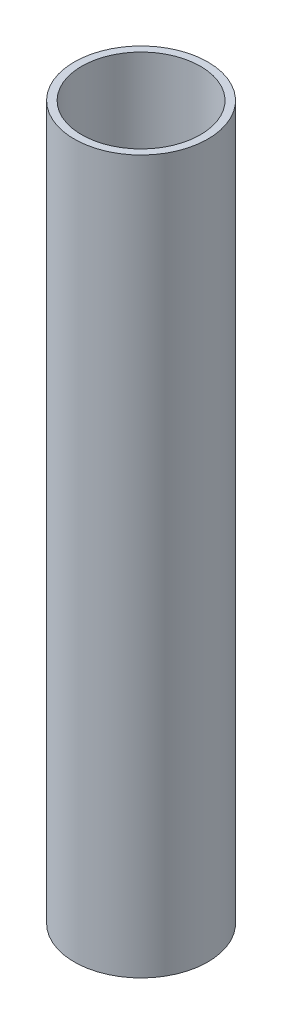
ISO-10303-21;
HEADER;
FILE_DESCRIPTION(('STEP AP214'),'2;1');
FILE_NAME('part.step','',(''),(''),'','','');
FILE_SCHEMA(('AUTOMOTIVE_DESIGN { 1 0 10303 214 1 1 1 1 }'));
ENDSEC;
DATA;
#1=APPLICATION_CONTEXT('core data for automotive mechanical design processes');
#2=APPLICATION_PROTOCOL_DEFINITION('international standard','automotive_design',2000,#1);
#3=PRODUCT_CONTEXT('',#1,'mechanical');
#4=PRODUCT('Part','Part','',(#3));
#5=PRODUCT_RELATED_PRODUCT_CATEGORY('part','',(#4));
#6=PRODUCT_DEFINITION_FORMATION('','',#4);
#7=PRODUCT_DEFINITION_CONTEXT('part definition',#1,'design');
#8=PRODUCT_DEFINITION('design','',#6,#7);
#9=PRODUCT_DEFINITION_SHAPE('','',#8);
#10=(LENGTH_UNIT() NAMED_UNIT(*) SI_UNIT(.MILLI.,.METRE.));
#11=(NAMED_UNIT(*) PLANE_ANGLE_UNIT() SI_UNIT($,.RADIAN.));
#12=(NAMED_UNIT(*) SI_UNIT($,.STERADIAN.) SOLID_ANGLE_UNIT());
#13=UNCERTAINTY_MEASURE_WITH_UNIT(LENGTH_MEASURE(1.E-05),#10,'distance_accuracy_value','');
#14=(GEOMETRIC_REPRESENTATION_CONTEXT(3) GLOBAL_UNCERTAINTY_ASSIGNED_CONTEXT((#13)) GLOBAL_UNIT_ASSIGNED_CONTEXT((#10,
#11,#12)) REPRESENTATION_CONTEXT('',''));
#15=CARTESIAN_POINT('',(0.,0.,0.));
#16=DIRECTION('',(0.,0.,1.));
#17=DIRECTION('',(1.,0.,0.));
#18=AXIS2_PLACEMENT_3D('',#15,#16,#17);
#19=CARTESIAN_POINT('',(0.,609.6,0.));
#20=DIRECTION('',(0.,1.,0.));
#21=DIRECTION('',(0.,0.,1.));
#22=AXIS2_PLACEMENT_3D('',#19,#20,#21);
#23=PLANE('',#22);
#24=CARTESIAN_POINT('',(0.,609.6,0.));
#25=DIRECTION('',(0.,1.,0.));
#26=DIRECTION('',(0.,0.,1.));
#27=AXIS2_PLACEMENT_3D('',#24,#25,#26);
#28=CIRCLE('',#27,57.15);
#29=CARTESIAN_POINT('',(0.,609.6,-57.15));
#30=VERTEX_POINT('',#29);
#31=EDGE_CURVE('E10',#30,#30,#28,.T.);
#32=ORIENTED_EDGE('',*,*,#31,.T.);
#33=EDGE_LOOP('',(#32));
#34=FACE_BOUND('',#33,.T.);
#35=CARTESIAN_POINT('',(0.,609.6,0.));
#36=DIRECTION('',(0.,1.,0.));
#37=DIRECTION('',(0.,0.,1.));
#38=AXIS2_PLACEMENT_3D('',#35,#36,#37);
#39=CIRCLE('',#38,50.8);
#40=CARTESIAN_POINT('',(0.,609.6,-50.8));
#41=VERTEX_POINT('',#40);
#42=EDGE_CURVE('E45',#41,#41,#39,.T.);
#43=ORIENTED_EDGE('',*,*,#42,.F.);
#44=EDGE_LOOP('',(#43));
#45=FACE_BOUND('',#44,.T.);
#46=ADVANCED_FACE('F34',(#34,#45),#23,.T.);
#47=CARTESIAN_POINT('',(0.,0.,0.));
#48=DIRECTION('',(0.,1.,0.));
#49=DIRECTION('',(0.,0.,1.));
#50=AXIS2_PLACEMENT_3D('',#47,#48,#49);
#51=PLANE('',#50);
#52=CARTESIAN_POINT('',(0.,0.,0.));
#53=DIRECTION('',(0.,1.,0.));
#54=DIRECTION('',(0.,0.,1.));
#55=AXIS2_PLACEMENT_3D('',#52,#53,#54);
#56=CIRCLE('',#55,57.15);
#57=CARTESIAN_POINT('',(0.,0.,-57.15));
#58=VERTEX_POINT('',#57);
#59=EDGE_CURVE('E38',#58,#58,#56,.T.);
#60=ORIENTED_EDGE('',*,*,#59,.F.);
#61=EDGE_LOOP('',(#60));
#62=FACE_BOUND('',#61,.T.);
#63=CARTESIAN_POINT('',(0.,0.,0.));
#64=DIRECTION('',(0.,1.,0.));
#65=DIRECTION('',(0.,0.,1.));
#66=AXIS2_PLACEMENT_3D('',#63,#64,#65);
#67=CIRCLE('',#66,50.8);
#68=CARTESIAN_POINT('',(0.,0.,-50.8));
#69=VERTEX_POINT('',#68);
#70=EDGE_CURVE('E47',#69,#69,#67,.T.);
#71=ORIENTED_EDGE('',*,*,#70,.T.);
#72=EDGE_LOOP('',(#71));
#73=FACE_BOUND('',#72,.T.);
#74=ADVANCED_FACE('F57',(#62,#73),#51,.F.);
#75=CARTESIAN_POINT('',(0.,609.6,0.));
#76=DIRECTION('',(0.,-1.,0.));
#77=DIRECTION('',(0.,0.,-1.));
#78=AXIS2_PLACEMENT_3D('',#75,#76,#77);
#79=CYLINDRICAL_SURFACE('',#78,57.15);
#80=CARTESIAN_POINT('',(0.,609.6,-57.15));
#81=CARTESIAN_POINT('',(0.,603.25,-57.15));
#82=CARTESIAN_POINT('',(0.,596.9,-57.15));
#83=CARTESIAN_POINT('',(0.,584.2,-57.15));
#84=CARTESIAN_POINT('',(0.,577.85,-57.15));
#85=CARTESIAN_POINT('',(0.,565.15,-57.15));
#86=CARTESIAN_POINT('',(0.,558.8,-57.15));
#87=CARTESIAN_POINT('',(0.,546.1,-57.15));
#88=CARTESIAN_POINT('',(0.,539.75,-57.15));
#89=CARTESIAN_POINT('',(0.,527.05,-57.15));
#90=CARTESIAN_POINT('',(0.,520.7,-57.15));
#91=CARTESIAN_POINT('',(0.,508.,-57.15));
#92=CARTESIAN_POINT('',(0.,501.65,-57.15));
#93=CARTESIAN_POINT('',(0.,488.95,-57.15));
#94=CARTESIAN_POINT('',(0.,482.6,-57.15));
#95=CARTESIAN_POINT('',(0.,469.9,-57.15));
#96=CARTESIAN_POINT('',(0.,463.55,-57.15));
#97=CARTESIAN_POINT('',(0.,450.85,-57.15));
#98=CARTESIAN_POINT('',(0.,444.5,-57.15));
#99=CARTESIAN_POINT('',(0.,431.8,-57.15));
#100=CARTESIAN_POINT('',(0.,425.45,-57.15));
#101=CARTESIAN_POINT('',(0.,412.75,-57.15));
#102=CARTESIAN_POINT('',(0.,406.4,-57.15));
#103=CARTESIAN_POINT('',(0.,393.7,-57.15));
#104=CARTESIAN_POINT('',(0.,387.35,-57.15));
#105=CARTESIAN_POINT('',(0.,374.65,-57.15));
#106=CARTESIAN_POINT('',(0.,368.3,-57.15));
#107=CARTESIAN_POINT('',(0.,355.6,-57.15));
#108=CARTESIAN_POINT('',(0.,349.25,-57.15));
#109=CARTESIAN_POINT('',(0.,336.55,-57.15));
#110=CARTESIAN_POINT('',(0.,330.2,-57.15));
#111=CARTESIAN_POINT('',(0.,317.5,-57.15));
#112=CARTESIAN_POINT('',(0.,311.15,-57.15));
#113=CARTESIAN_POINT('',(0.,298.45,-57.15));
#114=CARTESIAN_POINT('',(0.,292.1,-57.15));
#115=CARTESIAN_POINT('',(0.,279.4,-57.15));
#116=CARTESIAN_POINT('',(0.,273.05,-57.15));
#117=CARTESIAN_POINT('',(0.,260.35,-57.15));
#118=CARTESIAN_POINT('',(0.,254.,-57.15));
#119=CARTESIAN_POINT('',(0.,241.3,-57.15));
#120=CARTESIAN_POINT('',(0.,234.95,-57.15));
#121=CARTESIAN_POINT('',(0.,222.25,-57.15));
#122=CARTESIAN_POINT('',(0.,215.9,-57.15));
#123=CARTESIAN_POINT('',(0.,203.2,-57.15));
#124=CARTESIAN_POINT('',(0.,196.85,-57.15));
#125=CARTESIAN_POINT('',(0.,184.15,-57.15));
#126=CARTESIAN_POINT('',(0.,177.8,-57.15));
#127=CARTESIAN_POINT('',(0.,165.1,-57.15));
#128=CARTESIAN_POINT('',(0.,158.75,-57.15));
#129=CARTESIAN_POINT('',(0.,146.05,-57.15));
#130=CARTESIAN_POINT('',(0.,139.7,-57.15));
#131=CARTESIAN_POINT('',(0.,127.,-57.15));
#132=CARTESIAN_POINT('',(0.,120.65,-57.15));
#133=CARTESIAN_POINT('',(0.,107.95,-57.15));
#134=CARTESIAN_POINT('',(0.,101.6,-57.15));
#135=CARTESIAN_POINT('',(0.,88.9,-57.15));
#136=CARTESIAN_POINT('',(0.,82.5500000000001,-57.15));
#137=CARTESIAN_POINT('',(0.,69.85,-57.15));
#138=CARTESIAN_POINT('',(0.,63.5,-57.15));
#139=CARTESIAN_POINT('',(0.,50.8,-57.15));
#140=CARTESIAN_POINT('',(0.,44.45,-57.15));
#141=CARTESIAN_POINT('',(0.,31.75,-57.15));
#142=CARTESIAN_POINT('',(0.,25.4,-57.15));
#143=CARTESIAN_POINT('',(0.,12.7,-57.15));
#144=CARTESIAN_POINT('',(0.,6.35000000000001,-57.15));
#145=CARTESIAN_POINT('',(0.,0.,-57.15));
#146=B_SPLINE_CURVE_WITH_KNOTS('',3,(#80,#81,#82,#83,#84,#85,#86,#87,#88,#89,#90,#91,#92,#93,
#94,#95,#96,#97,#98,#99,#100,#101,#102,#103,#104,#105,#106,#107,#108,#109,#110,#111,#112,#113,
#114,#115,#116,#117,#118,#119,#120,#121,#122,#123,#124,#125,#126,#127,#128,#129,#130,#131,#132,
#133,#134,#135,#136,#137,#138,#139,#140,#141,#142,#143,#144,#145),.UNSPECIFIED.,.F.,.F.,(4,2,2,
2,2,2,2,2,2,2,2,2,2,2,2,2,2,2,2,2,2,2,2,2,2,2,2,2,2,2,2,2,4),(0.,19.0499999999999,
38.0999999999999,57.1499999999999,76.1999999999999,95.2499999999999,114.3,133.35,152.4,171.45,
190.5,209.55,228.6,247.65,266.7,285.75,304.8,323.85,342.9,361.95,381.,400.05,419.1,438.15,457.2,
476.25,495.3,514.35,533.4,552.45,571.5,590.55,609.6),.UNSPECIFIED.);
#147=EDGE_CURVE('BSEAM36',#30,#58,#146,.T.);
#148=ORIENTED_EDGE('',*,*,#31,.F.);
#149=ORIENTED_EDGE('',*,*,#59,.T.);
#150=ORIENTED_EDGE('',*,*,#147,.T.);
#151=ORIENTED_EDGE('',*,*,#147,.F.);
#152=EDGE_LOOP('',(#148,#150,#149,#151));
#153=FACE_BOUND('',#152,.T.);
#154=ADVANCED_FACE('F36',(#153),#79,.T.);
#155=CARTESIAN_POINT('',(0.,609.6,0.));
#156=DIRECTION('',(0.,-1.,0.));
#157=DIRECTION('',(0.,0.,-1.));
#158=AXIS2_PLACEMENT_3D('',#155,#156,#157);
#159=CYLINDRICAL_SURFACE('',#158,50.8);
#160=CARTESIAN_POINT('',(0.,609.6,-50.8));
#161=CARTESIAN_POINT('',(0.,603.25,-50.8));
#162=CARTESIAN_POINT('',(0.,596.9,-50.8));
#163=CARTESIAN_POINT('',(0.,584.2,-50.8));
#164=CARTESIAN_POINT('',(0.,577.85,-50.8));
#165=CARTESIAN_POINT('',(0.,565.15,-50.8));
#166=CARTESIAN_POINT('',(0.,558.8,-50.8));
#167=CARTESIAN_POINT('',(0.,546.1,-50.8));
#168=CARTESIAN_POINT('',(0.,539.75,-50.8));
#169=CARTESIAN_POINT('',(0.,527.05,-50.8));
#170=CARTESIAN_POINT('',(0.,520.7,-50.8));
#171=CARTESIAN_POINT('',(0.,508.,-50.8));
#172=CARTESIAN_POINT('',(0.,501.65,-50.8));
#173=CARTESIAN_POINT('',(0.,488.95,-50.8));
#174=CARTESIAN_POINT('',(0.,482.6,-50.8));
#175=CARTESIAN_POINT('',(0.,469.9,-50.8));
#176=CARTESIAN_POINT('',(0.,463.55,-50.8));
#177=CARTESIAN_POINT('',(0.,450.85,-50.8));
#178=CARTESIAN_POINT('',(0.,444.5,-50.8));
#179=CARTESIAN_POINT('',(0.,431.8,-50.8));
#180=CARTESIAN_POINT('',(0.,425.45,-50.8));
#181=CARTESIAN_POINT('',(0.,412.75,-50.8));
#182=CARTESIAN_POINT('',(0.,406.4,-50.8));
#183=CARTESIAN_POINT('',(0.,393.7,-50.8));
#184=CARTESIAN_POINT('',(0.,387.35,-50.8));
#185=CARTESIAN_POINT('',(0.,374.65,-50.8));
#186=CARTESIAN_POINT('',(0.,368.3,-50.8));
#187=CARTESIAN_POINT('',(0.,355.6,-50.8));
#188=CARTESIAN_POINT('',(0.,349.25,-50.8));
#189=CARTESIAN_POINT('',(0.,336.55,-50.8));
#190=CARTESIAN_POINT('',(0.,330.2,-50.8));
#191=CARTESIAN_POINT('',(0.,317.5,-50.8));
#192=CARTESIAN_POINT('',(0.,311.15,-50.8));
#193=CARTESIAN_POINT('',(0.,298.45,-50.8));
#194=CARTESIAN_POINT('',(0.,292.1,-50.8));
#195=CARTESIAN_POINT('',(0.,279.4,-50.8));
#196=CARTESIAN_POINT('',(0.,273.05,-50.8));
#197=CARTESIAN_POINT('',(0.,260.35,-50.8));
#198=CARTESIAN_POINT('',(0.,254.,-50.8));
#199=CARTESIAN_POINT('',(0.,241.3,-50.8));
#200=CARTESIAN_POINT('',(0.,234.95,-50.8));
#201=CARTESIAN_POINT('',(0.,222.25,-50.8));
#202=CARTESIAN_POINT('',(0.,215.9,-50.8));
#203=CARTESIAN_POINT('',(0.,203.2,-50.8));
#204=CARTESIAN_POINT('',(0.,196.85,-50.8));
#205=CARTESIAN_POINT('',(0.,184.15,-50.8));
#206=CARTESIAN_POINT('',(0.,177.8,-50.8));
#207=CARTESIAN_POINT('',(0.,165.1,-50.8));
#208=CARTESIAN_POINT('',(0.,158.75,-50.8));
#209=CARTESIAN_POINT('',(0.,146.05,-50.8));
#210=CARTESIAN_POINT('',(0.,139.7,-50.8));
#211=CARTESIAN_POINT('',(0.,127.,-50.8));
#212=CARTESIAN_POINT('',(0.,120.65,-50.8));
#213=CARTESIAN_POINT('',(0.,107.95,-50.8));
#214=CARTESIAN_POINT('',(0.,101.6,-50.8));
#215=CARTESIAN_POINT('',(0.,88.9,-50.8));
#216=CARTESIAN_POINT('',(0.,82.5500000000001,-50.8));
#217=CARTESIAN_POINT('',(0.,69.85,-50.8));
#218=CARTESIAN_POINT('',(0.,63.5,-50.8));
#219=CARTESIAN_POINT('',(0.,50.8,-50.8));
#220=CARTESIAN_POINT('',(0.,44.45,-50.8));
#221=CARTESIAN_POINT('',(0.,31.75,-50.8));
#222=CARTESIAN_POINT('',(0.,25.4,-50.8));
#223=CARTESIAN_POINT('',(0.,12.7,-50.8));
#224=CARTESIAN_POINT('',(0.,6.35000000000001,-50.8));
#225=CARTESIAN_POINT('',(0.,0.,-50.8));
#226=B_SPLINE_CURVE_WITH_KNOTS('',3,(#160,#161,#162,#163,#164,#165,#166,#167,#168,#169,#170,
#171,#172,#173,#174,#175,#176,#177,#178,#179,#180,#181,#182,#183,#184,#185,#186,#187,#188,#189,
#190,#191,#192,#193,#194,#195,#196,#197,#198,#199,#200,#201,#202,#203,#204,#205,#206,#207,#208,
#209,#210,#211,#212,#213,#214,#215,#216,#217,#218,#219,#220,#221,#222,#223,#224,#225),
.UNSPECIFIED.,.F.,.F.,(4,2,2,2,2,2,2,2,2,2,2,2,2,2,2,2,2,2,2,2,2,2,2,2,2,2,2,2,2,2,2,2,4),(0.,
19.0499999999999,38.0999999999999,57.1499999999999,76.1999999999999,95.2499999999999,114.3,
133.35,152.4,171.45,190.5,209.55,228.6,247.65,266.7,285.75,304.8,323.85,342.9,361.95,381.,
400.05,419.1,438.15,457.2,476.25,495.3,514.35,533.4,552.45,571.5,590.55,609.6),.UNSPECIFIED.);
#227=EDGE_CURVE('BSEAM53',#41,#69,#226,.T.);
#228=ORIENTED_EDGE('',*,*,#42,.T.);
#229=ORIENTED_EDGE('',*,*,#70,.F.);
#230=ORIENTED_EDGE('',*,*,#227,.T.);
#231=ORIENTED_EDGE('',*,*,#227,.F.);
#232=EDGE_LOOP('',(#228,#230,#229,#231));
#233=FACE_BOUND('',#232,.T.);
#234=ADVANCED_FACE('F53',(#233),#159,.F.);
#235=CLOSED_SHELL('',(#46,#74,#154,#234));
#236=MANIFOLD_SOLID_BREP('B2',#235);
#237=ADVANCED_BREP_SHAPE_REPRESENTATION('',(#18,#236),#14);
#238=SHAPE_DEFINITION_REPRESENTATION(#9,#237);
ENDSEC;
END-ISO-10303-21;
